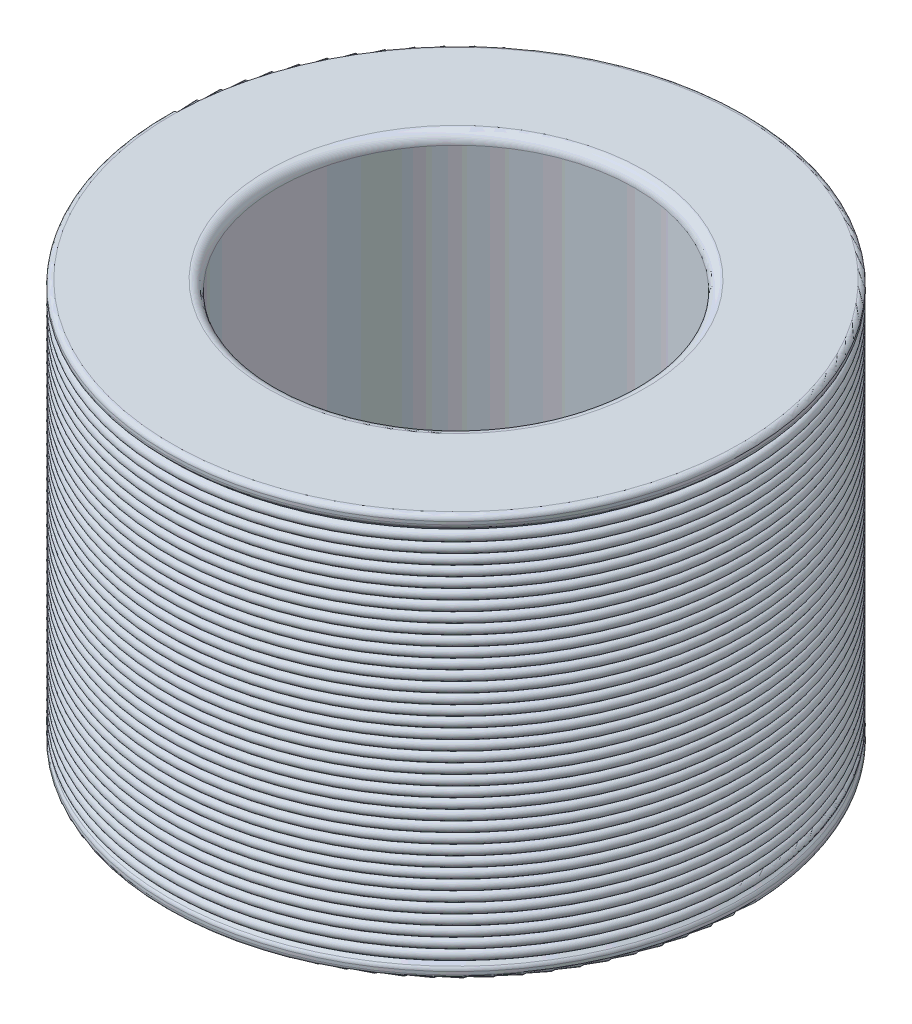
ISO-10303-21;
HEADER;
FILE_DESCRIPTION(('STEP AP214'),'2;1');
FILE_NAME('part.step','',(''),(''),'','','');
FILE_SCHEMA(('AUTOMOTIVE_DESIGN { 1 0 10303 214 1 1 1 1 }'));
ENDSEC;
DATA;
#1=APPLICATION_CONTEXT('core data for automotive mechanical design processes');
#2=APPLICATION_PROTOCOL_DEFINITION('international standard','automotive_design',2000,#1);
#3=PRODUCT_CONTEXT('',#1,'mechanical');
#4=PRODUCT('Part','Part','',(#3));
#5=PRODUCT_RELATED_PRODUCT_CATEGORY('part','',(#4));
#6=PRODUCT_DEFINITION_FORMATION('','',#4);
#7=PRODUCT_DEFINITION_CONTEXT('part definition',#1,'design');
#8=PRODUCT_DEFINITION('design','',#6,#7);
#9=PRODUCT_DEFINITION_SHAPE('','',#8);
#10=(LENGTH_UNIT() NAMED_UNIT(*) SI_UNIT(.MILLI.,.METRE.));
#11=(NAMED_UNIT(*) PLANE_ANGLE_UNIT() SI_UNIT($,.RADIAN.));
#12=(NAMED_UNIT(*) SI_UNIT($,.STERADIAN.) SOLID_ANGLE_UNIT());
#13=UNCERTAINTY_MEASURE_WITH_UNIT(LENGTH_MEASURE(1.E-05),#10,'distance_accuracy_value','');
#14=(GEOMETRIC_REPRESENTATION_CONTEXT(3) GLOBAL_UNCERTAINTY_ASSIGNED_CONTEXT((#13)) GLOBAL_UNIT_ASSIGNED_CONTEXT((#10,
#11,#12)) REPRESENTATION_CONTEXT('',''));
#15=CARTESIAN_POINT('',(0.,0.,0.));
#16=DIRECTION('',(0.,0.,1.));
#17=DIRECTION('',(1.,0.,0.));
#18=AXIS2_PLACEMENT_3D('',#15,#16,#17);
#19=CARTESIAN_POINT('',(0.,11.1343365087752,0.));
#20=DIRECTION('',(0.,1.,0.));
#21=DIRECTION('',(0.,0.,1.));
#22=AXIS2_PLACEMENT_3D('',#19,#20,#21);
#23=CYLINDRICAL_SURFACE('',#22,3.55);
#24=CARTESIAN_POINT('',(0.,0.199999999999999,0.));
#25=DIRECTION('',(0.,1.,0.));
#26=DIRECTION('',(0.,0.,1.));
#27=AXIS2_PLACEMENT_3D('',#24,#25,#26);
#28=CIRCLE('',#27,3.55);
#29=CARTESIAN_POINT('',(0.,0.199999999999999,3.55));
#30=VERTEX_POINT('',#29);
#31=EDGE_CURVE('E67',#30,#30,#28,.F.);
#32=ORIENTED_EDGE('',*,*,#31,.T.);
#33=EDGE_LOOP('',(#32));
#34=FACE_BOUND('',#33,.T.);
#35=CARTESIAN_POINT('',(0.,7.8,0.));
#36=DIRECTION('',(0.,-1.,0.));
#37=DIRECTION('',(0.,0.,-1.));
#38=AXIS2_PLACEMENT_3D('',#35,#36,#37);
#39=CIRCLE('',#38,3.55);
#40=CARTESIAN_POINT('',(0.,7.8,-3.55));
#41=VERTEX_POINT('',#40);
#42=EDGE_CURVE('E70',#41,#41,#39,.F.);
#43=ORIENTED_EDGE('',*,*,#42,.T.);
#44=EDGE_LOOP('',(#43));
#45=FACE_BOUND('',#44,.T.);
#46=ADVANCED_FACE('F32',(#34,#45),#23,.F.);
#47=CARTESIAN_POINT('',(0.,8.,-3.55));
#48=DIRECTION('',(0.,-1.,0.));
#49=DIRECTION('',(0.,0.,-1.));
#50=AXIS2_PLACEMENT_3D('',#47,#48,#49);
#51=PLANE('',#50);
#52=CARTESIAN_POINT('',(0.,8.,0.));
#53=DIRECTION('',(0.,-1.,0.));
#54=DIRECTION('',(0.,0.,-1.));
#55=AXIS2_PLACEMENT_3D('',#52,#53,#54);
#56=CIRCLE('',#55,5.65);
#57=CARTESIAN_POINT('',(0.,8.,-5.65));
#58=VERTEX_POINT('',#57);
#59=EDGE_CURVE('E39',#58,#58,#56,.F.);
#60=ORIENTED_EDGE('',*,*,#59,.T.);
#61=EDGE_LOOP('',(#60));
#62=FACE_BOUND('',#61,.T.);
#63=CARTESIAN_POINT('',(0.,8.,0.));
#64=DIRECTION('',(0.,-1.,0.));
#65=DIRECTION('',(0.,0.,-1.));
#66=AXIS2_PLACEMENT_3D('',#63,#64,#65);
#67=CIRCLE('',#66,3.75);
#68=CARTESIAN_POINT('',(0.,8.,-3.75));
#69=VERTEX_POINT('',#68);
#70=EDGE_CURVE('E64',#69,#69,#67,.T.);
#71=ORIENTED_EDGE('',*,*,#70,.T.);
#72=EDGE_LOOP('',(#71));
#73=FACE_BOUND('',#72,.T.);
#74=ADVANCED_FACE('F208',(#62,#73),#51,.F.);
#75=CARTESIAN_POINT('',(0.,11.1343365087752,0.));
#76=DIRECTION('',(0.,1.,0.));
#77=DIRECTION('',(0.,0.,1.));
#78=AXIS2_PLACEMENT_3D('',#75,#76,#77);
#79=CYLINDRICAL_SURFACE('',#78,5.75);
#80=CARTESIAN_POINT('',(0.,7.84142135623731,0.));
#81=DIRECTION('',(0.,-1.,0.));
#82=DIRECTION('',(0.,0.,-1.));
#83=AXIS2_PLACEMENT_3D('',#80,#81,#82);
#84=CIRCLE('',#83,5.75);
#85=CARTESIAN_POINT('',(0.,7.84142135623731,-5.75));
#86=VERTEX_POINT('',#85);
#87=EDGE_CURVE('E47',#86,#86,#84,.F.);
#88=ORIENTED_EDGE('',*,*,#87,.T.);
#89=EDGE_LOOP('',(#88));
#90=FACE_BOUND('',#89,.T.);
#91=CARTESIAN_POINT('',(0.,7.9,0.));
#92=DIRECTION('',(0.,-1.,0.));
#93=DIRECTION('',(0.,0.,-1.));
#94=AXIS2_PLACEMENT_3D('',#91,#92,#93);
#95=CIRCLE('',#94,5.75);
#96=CARTESIAN_POINT('',(0.,7.9,-5.75));
#97=VERTEX_POINT('',#96);
#98=EDGE_CURVE('E52',#97,#97,#95,.T.);
#99=ORIENTED_EDGE('',*,*,#98,.T.);
#100=EDGE_LOOP('',(#99));
#101=FACE_BOUND('',#100,.T.);
#102=ADVANCED_FACE('F214',(#90,#101),#79,.T.);
#103=CARTESIAN_POINT('',(0.,7.7,0.));
#104=DIRECTION('',(0.,1.,0.));
#105=DIRECTION('',(0.,0.,1.));
#106=AXIS2_PLACEMENT_3D('',#103,#104,#105);
#107=CONICAL_SURFACE('',#106,5.65,0.785398163397444);
#108=CARTESIAN_POINT('',(0.,7.77071067811865,0.));
#109=DIRECTION('',(0.,-1.,0.));
#110=DIRECTION('',(0.,0.,-1.));
#111=AXIS2_PLACEMENT_3D('',#108,#109,#110);
#112=CIRCLE('',#111,5.72071067811865);
#113=CARTESIAN_POINT('',(0.,7.77071067811865,-5.72071067811865));
#114=VERTEX_POINT('',#113);
#115=EDGE_CURVE('E43',#114,#114,#112,.T.);
#116=ORIENTED_EDGE('',*,*,#115,.T.);
#117=EDGE_LOOP('',(#116));
#118=FACE_BOUND('',#117,.T.);
#119=CARTESIAN_POINT('',(0.,7.7,0.));
#120=DIRECTION('',(0.,-1.,0.));
#121=DIRECTION('',(0.,0.,-1.));
#122=AXIS2_PLACEMENT_3D('',#119,#120,#121);
#123=CIRCLE('',#122,5.65);
#124=CARTESIAN_POINT('',(0.,7.7,-5.65));
#125=VERTEX_POINT('',#124);
#126=EDGE_CURVE('E79',#125,#125,#123,.T.);
#127=ORIENTED_EDGE('',*,*,#126,.F.);
#128=EDGE_LOOP('',(#127));
#129=FACE_BOUND('',#128,.T.);
#130=ADVANCED_FACE('F247',(#118,#129),#107,.T.);
#131=CARTESIAN_POINT('',(0.,0.199999999999999,0.));
#132=DIRECTION('',(0.,-1.,0.));
#133=DIRECTION('',(0.,0.,-1.));
#134=AXIS2_PLACEMENT_3D('',#131,#132,#133);
#135=CONICAL_SURFACE('',#134,5.75,0.785398163397435);
#136=CARTESIAN_POINT('',(0.,0.229289321881342,0.));
#137=DIRECTION('',(0.,1.,0.));
#138=DIRECTION('',(0.,0.,1.));
#139=AXIS2_PLACEMENT_3D('',#136,#137,#138);
#140=CIRCLE('',#139,5.72071067811866);
#141=CARTESIAN_POINT('',(0.,0.229289321881342,5.72071067811866));
#142=VERTEX_POINT('',#141);
#143=EDGE_CURVE('E61',#142,#142,#140,.T.);
#144=ORIENTED_EDGE('',*,*,#143,.T.);
#145=EDGE_LOOP('',(#144));
#146=FACE_BOUND('',#145,.T.);
#147=CARTESIAN_POINT('',(0.,0.3,0.));
#148=DIRECTION('',(0.,1.,0.));
#149=DIRECTION('',(0.,0.,1.));
#150=AXIS2_PLACEMENT_3D('',#147,#148,#149);
#151=CIRCLE('',#150,5.65);
#152=CARTESIAN_POINT('',(0.,0.3,5.65));
#153=VERTEX_POINT('',#152);
#154=EDGE_CURVE('E76',#153,#153,#151,.T.);
#155=ORIENTED_EDGE('',*,*,#154,.F.);
#156=EDGE_LOOP('',(#155));
#157=FACE_BOUND('',#156,.T.);
#158=ADVANCED_FACE('F252',(#146,#157),#135,.T.);
#159=CARTESIAN_POINT('',(0.,11.1343365087752,0.));
#160=DIRECTION('',(0.,1.,0.));
#161=DIRECTION('',(0.,0.,1.));
#162=AXIS2_PLACEMENT_3D('',#159,#160,#161);
#163=CYLINDRICAL_SURFACE('',#162,5.75);
#164=CARTESIAN_POINT('',(0.,0.158578643762688,0.));
#165=DIRECTION('',(0.,-1.,0.));
#166=DIRECTION('',(0.,0.,-1.));
#167=AXIS2_PLACEMENT_3D('',#164,#165,#166);
#168=CIRCLE('',#167,5.75);
#169=CARTESIAN_POINT('',(0.,0.158578643762688,-5.75));
#170=VERTEX_POINT('',#169);
#171=EDGE_CURVE('E55',#170,#170,#168,.T.);
#172=ORIENTED_EDGE('',*,*,#171,.T.);
#173=EDGE_LOOP('',(#172));
#174=FACE_BOUND('',#173,.T.);
#175=CARTESIAN_POINT('',(0.,0.0999999999999994,0.));
#176=DIRECTION('',(0.,1.,0.));
#177=DIRECTION('',(0.,0.,1.));
#178=AXIS2_PLACEMENT_3D('',#175,#176,#177);
#179=CIRCLE('',#178,5.75);
#180=CARTESIAN_POINT('',(0.,0.0999999999999994,5.75));
#181=VERTEX_POINT('',#180);
#182=EDGE_CURVE('E58',#181,#181,#179,.T.);
#183=ORIENTED_EDGE('',*,*,#182,.T.);
#184=EDGE_LOOP('',(#183));
#185=FACE_BOUND('',#184,.T.);
#186=ADVANCED_FACE('F258',(#174,#185),#163,.T.);
#187=CARTESIAN_POINT('',(0.,0.,-5.75));
#188=DIRECTION('',(0.,1.,0.));
#189=DIRECTION('',(0.,0.,1.));
#190=AXIS2_PLACEMENT_3D('',#187,#188,#189);
#191=PLANE('',#190);
#192=CARTESIAN_POINT('',(0.,0.,0.));
#193=DIRECTION('',(0.,1.,0.));
#194=DIRECTION('',(0.,0.,1.));
#195=AXIS2_PLACEMENT_3D('',#192,#193,#194);
#196=CIRCLE('',#195,5.65);
#197=CARTESIAN_POINT('',(0.,0.,5.65));
#198=VERTEX_POINT('',#197);
#199=EDGE_CURVE('E10',#198,#198,#196,.F.);
#200=ORIENTED_EDGE('',*,*,#199,.T.);
#201=EDGE_LOOP('',(#200));
#202=FACE_BOUND('',#201,.T.);
#203=CARTESIAN_POINT('',(0.,0.,0.));
#204=DIRECTION('',(0.,1.,0.));
#205=DIRECTION('',(0.,0.,1.));
#206=AXIS2_PLACEMENT_3D('',#203,#204,#205);
#207=CIRCLE('',#206,3.75);
#208=CARTESIAN_POINT('',(0.,0.,3.75));
#209=VERTEX_POINT('',#208);
#210=EDGE_CURVE('E73',#209,#209,#207,.T.);
#211=ORIENTED_EDGE('',*,*,#210,.T.);
#212=EDGE_LOOP('',(#211));
#213=FACE_BOUND('',#212,.T.);
#214=ADVANCED_FACE('F223',(#202,#213),#191,.F.);
#215=CARTESIAN_POINT('',(0.,0.199999999999999,0.));
#216=DIRECTION('',(0.,1.,0.));
#217=DIRECTION('',(0.,0.,1.));
#218=AXIS2_PLACEMENT_3D('',#215,#216,#217);
#219=TOROIDAL_SURFACE('',#218,3.75,0.2);
#220=ORIENTED_EDGE('',*,*,#31,.F.);
#221=EDGE_LOOP('',(#220));
#222=FACE_BOUND('',#221,.T.);
#223=ORIENTED_EDGE('',*,*,#210,.F.);
#224=EDGE_LOOP('',(#223));
#225=FACE_BOUND('',#224,.T.);
#226=ADVANCED_FACE('F219',(#222,#225),#219,.T.);
#227=CARTESIAN_POINT('',(0.,7.8,0.));
#228=DIRECTION('',(0.,-1.,0.));
#229=DIRECTION('',(0.,0.,-1.));
#230=AXIS2_PLACEMENT_3D('',#227,#228,#229);
#231=TOROIDAL_SURFACE('',#230,3.75,0.2);
#232=ORIENTED_EDGE('',*,*,#70,.F.);
#233=EDGE_LOOP('',(#232));
#234=FACE_BOUND('',#233,.T.);
#235=ORIENTED_EDGE('',*,*,#42,.F.);
#236=EDGE_LOOP('',(#235));
#237=FACE_BOUND('',#236,.T.);
#238=ADVANCED_FACE('F222',(#234,#237),#231,.T.);
#239=CARTESIAN_POINT('',(0.,0.158578643762688,0.));
#240=DIRECTION('',(0.,-1.,0.));
#241=DIRECTION('',(0.,0.,-1.));
#242=AXIS2_PLACEMENT_3D('',#239,#240,#241);
#243=TOROIDAL_SURFACE('',#242,5.65,0.1);
#244=ORIENTED_EDGE('',*,*,#171,.F.);
#245=EDGE_LOOP('',(#244));
#246=FACE_BOUND('',#245,.T.);
#247=ORIENTED_EDGE('',*,*,#143,.F.);
#248=EDGE_LOOP('',(#247));
#249=FACE_BOUND('',#248,.T.);
#250=ADVANCED_FACE('F227',(#246,#249),#243,.T.);
#251=CARTESIAN_POINT('',(0.,7.84142135623731,0.));
#252=DIRECTION('',(0.,-1.,0.));
#253=DIRECTION('',(0.,0.,-1.));
#254=AXIS2_PLACEMENT_3D('',#251,#252,#253);
#255=TOROIDAL_SURFACE('',#254,5.65,0.1);
#256=ORIENTED_EDGE('',*,*,#115,.F.);
#257=EDGE_LOOP('',(#256));
#258=FACE_BOUND('',#257,.T.);
#259=ORIENTED_EDGE('',*,*,#87,.F.);
#260=EDGE_LOOP('',(#259));
#261=FACE_BOUND('',#260,.T.);
#262=ADVANCED_FACE('F231',(#258,#261),#255,.T.);
#263=CARTESIAN_POINT('',(0.,7.9,0.));
#264=DIRECTION('',(0.,-1.,0.));
#265=DIRECTION('',(0.,0.,-1.));
#266=AXIS2_PLACEMENT_3D('',#263,#264,#265);
#267=TOROIDAL_SURFACE('',#266,5.65,0.1);
#268=ORIENTED_EDGE('',*,*,#98,.F.);
#269=EDGE_LOOP('',(#268));
#270=FACE_BOUND('',#269,.T.);
#271=ORIENTED_EDGE('',*,*,#59,.F.);
#272=EDGE_LOOP('',(#271));
#273=FACE_BOUND('',#272,.T.);
#274=ADVANCED_FACE('F234',(#270,#273),#267,.T.);
#275=CARTESIAN_POINT('',(0.,0.0999999999999994,0.));
#276=DIRECTION('',(0.,1.,0.));
#277=DIRECTION('',(0.,0.,1.));
#278=AXIS2_PLACEMENT_3D('',#275,#276,#277);
#279=TOROIDAL_SURFACE('',#278,5.65,0.1);
#280=ORIENTED_EDGE('',*,*,#199,.F.);
#281=EDGE_LOOP('',(#280));
#282=FACE_BOUND('',#281,.T.);
#283=ORIENTED_EDGE('',*,*,#182,.F.);
#284=EDGE_LOOP('',(#283));
#285=FACE_BOUND('',#284,.T.);
#286=ADVANCED_FACE('F34',(#282,#285),#279,.T.);
#287=CARTESIAN_POINT('',(0.,7.6,0.));
#288=DIRECTION('',(0.,-1.,0.));
#289=DIRECTION('',(0.,0.,-1.));
#290=AXIS2_PLACEMENT_3D('',#287,#288,#289);
#291=TOROIDAL_SURFACE('',#290,5.65,0.0999999999999998);
#292=ORIENTED_EDGE('',*,*,#126,.T.);
#293=EDGE_LOOP('',(#292));
#294=FACE_BOUND('',#293,.T.);
#295=CARTESIAN_POINT('',(0.,7.5,0.));
#296=DIRECTION('',(0.,-1.,0.));
#297=DIRECTION('',(0.,0.,-1.));
#298=AXIS2_PLACEMENT_3D('',#295,#296,#297);
#299=CIRCLE('',#298,5.65);
#300=CARTESIAN_POINT('',(0.,7.5,-5.65));
#301=VERTEX_POINT('',#300);
#302=EDGE_CURVE('E82',#301,#301,#299,.T.);
#303=ORIENTED_EDGE('',*,*,#302,.F.);
#304=EDGE_LOOP('',(#303));
#305=FACE_BOUND('',#304,.T.);
#306=ADVANCED_FACE('F241',(#294,#305),#291,.T.);
#307=CARTESIAN_POINT('',(0.,7.4,0.));
#308=DIRECTION('',(0.,-1.,0.));
#309=DIRECTION('',(0.,0.,-1.));
#310=AXIS2_PLACEMENT_3D('',#307,#308,#309);
#311=TOROIDAL_SURFACE('',#310,5.65,0.0999999999999998);
#312=ORIENTED_EDGE('',*,*,#302,.T.);
#313=EDGE_LOOP('',(#312));
#314=FACE_BOUND('',#313,.T.);
#315=CARTESIAN_POINT('',(0.,7.3,0.));
#316=DIRECTION('',(0.,-1.,0.));
#317=DIRECTION('',(0.,0.,-1.));
#318=AXIS2_PLACEMENT_3D('',#315,#316,#317);
#319=CIRCLE('',#318,5.65);
#320=CARTESIAN_POINT('',(0.,7.3,-5.65));
#321=VERTEX_POINT('',#320);
#322=EDGE_CURVE('E85',#321,#321,#319,.T.);
#323=ORIENTED_EDGE('',*,*,#322,.F.);
#324=EDGE_LOOP('',(#323));
#325=FACE_BOUND('',#324,.T.);
#326=ADVANCED_FACE('F267',(#314,#325),#311,.T.);
#327=CARTESIAN_POINT('',(0.,7.2,0.));
#328=DIRECTION('',(0.,-1.,0.));
#329=DIRECTION('',(0.,0.,-1.));
#330=AXIS2_PLACEMENT_3D('',#327,#328,#329);
#331=TOROIDAL_SURFACE('',#330,5.65,0.0999999999999998);
#332=ORIENTED_EDGE('',*,*,#322,.T.);
#333=EDGE_LOOP('',(#332));
#334=FACE_BOUND('',#333,.T.);
#335=CARTESIAN_POINT('',(0.,7.1,0.));
#336=DIRECTION('',(0.,-1.,0.));
#337=DIRECTION('',(0.,0.,-1.));
#338=AXIS2_PLACEMENT_3D('',#335,#336,#337);
#339=CIRCLE('',#338,5.65);
#340=CARTESIAN_POINT('',(0.,7.1,-5.65));
#341=VERTEX_POINT('',#340);
#342=EDGE_CURVE('E88',#341,#341,#339,.T.);
#343=ORIENTED_EDGE('',*,*,#342,.F.);
#344=EDGE_LOOP('',(#343));
#345=FACE_BOUND('',#344,.T.);
#346=ADVANCED_FACE('F271',(#334,#345),#331,.T.);
#347=CARTESIAN_POINT('',(0.,7.,0.));
#348=DIRECTION('',(0.,-1.,0.));
#349=DIRECTION('',(0.,0.,-1.));
#350=AXIS2_PLACEMENT_3D('',#347,#348,#349);
#351=TOROIDAL_SURFACE('',#350,5.65,0.0999999999999998);
#352=ORIENTED_EDGE('',*,*,#342,.T.);
#353=EDGE_LOOP('',(#352));
#354=FACE_BOUND('',#353,.T.);
#355=CARTESIAN_POINT('',(0.,6.9,0.));
#356=DIRECTION('',(0.,-1.,0.));
#357=DIRECTION('',(0.,0.,-1.));
#358=AXIS2_PLACEMENT_3D('',#355,#356,#357);
#359=CIRCLE('',#358,5.65);
#360=CARTESIAN_POINT('',(0.,6.9,-5.65));
#361=VERTEX_POINT('',#360);
#362=EDGE_CURVE('E91',#361,#361,#359,.T.);
#363=ORIENTED_EDGE('',*,*,#362,.F.);
#364=EDGE_LOOP('',(#363));
#365=FACE_BOUND('',#364,.T.);
#366=ADVANCED_FACE('F275',(#354,#365),#351,.T.);
#367=CARTESIAN_POINT('',(0.,6.8,0.));
#368=DIRECTION('',(0.,-1.,0.));
#369=DIRECTION('',(0.,0.,-1.));
#370=AXIS2_PLACEMENT_3D('',#367,#368,#369);
#371=TOROIDAL_SURFACE('',#370,5.65,0.0999999999999998);
#372=ORIENTED_EDGE('',*,*,#362,.T.);
#373=EDGE_LOOP('',(#372));
#374=FACE_BOUND('',#373,.T.);
#375=CARTESIAN_POINT('',(0.,6.7,0.));
#376=DIRECTION('',(0.,-1.,0.));
#377=DIRECTION('',(0.,0.,-1.));
#378=AXIS2_PLACEMENT_3D('',#375,#376,#377);
#379=CIRCLE('',#378,5.65);
#380=CARTESIAN_POINT('',(0.,6.7,-5.65));
#381=VERTEX_POINT('',#380);
#382=EDGE_CURVE('E94',#381,#381,#379,.T.);
#383=ORIENTED_EDGE('',*,*,#382,.F.);
#384=EDGE_LOOP('',(#383));
#385=FACE_BOUND('',#384,.T.);
#386=ADVANCED_FACE('F279',(#374,#385),#371,.T.);
#387=CARTESIAN_POINT('',(0.,6.6,0.));
#388=DIRECTION('',(0.,-1.,0.));
#389=DIRECTION('',(0.,0.,-1.));
#390=AXIS2_PLACEMENT_3D('',#387,#388,#389);
#391=TOROIDAL_SURFACE('',#390,5.65,0.0999999999999998);
#392=ORIENTED_EDGE('',*,*,#382,.T.);
#393=EDGE_LOOP('',(#392));
#394=FACE_BOUND('',#393,.T.);
#395=CARTESIAN_POINT('',(0.,6.5,0.));
#396=DIRECTION('',(0.,-1.,0.));
#397=DIRECTION('',(0.,0.,-1.));
#398=AXIS2_PLACEMENT_3D('',#395,#396,#397);
#399=CIRCLE('',#398,5.65);
#400=CARTESIAN_POINT('',(0.,6.5,-5.65));
#401=VERTEX_POINT('',#400);
#402=EDGE_CURVE('E97',#401,#401,#399,.T.);
#403=ORIENTED_EDGE('',*,*,#402,.F.);
#404=EDGE_LOOP('',(#403));
#405=FACE_BOUND('',#404,.T.);
#406=ADVANCED_FACE('F283',(#394,#405),#391,.T.);
#407=CARTESIAN_POINT('',(0.,6.4,0.));
#408=DIRECTION('',(0.,-1.,0.));
#409=DIRECTION('',(0.,0.,-1.));
#410=AXIS2_PLACEMENT_3D('',#407,#408,#409);
#411=TOROIDAL_SURFACE('',#410,5.65,0.0999999999999998);
#412=ORIENTED_EDGE('',*,*,#402,.T.);
#413=EDGE_LOOP('',(#412));
#414=FACE_BOUND('',#413,.T.);
#415=CARTESIAN_POINT('',(0.,6.3,0.));
#416=DIRECTION('',(0.,-1.,0.));
#417=DIRECTION('',(0.,0.,-1.));
#418=AXIS2_PLACEMENT_3D('',#415,#416,#417);
#419=CIRCLE('',#418,5.65);
#420=CARTESIAN_POINT('',(0.,6.3,-5.65));
#421=VERTEX_POINT('',#420);
#422=EDGE_CURVE('E100',#421,#421,#419,.T.);
#423=ORIENTED_EDGE('',*,*,#422,.F.);
#424=EDGE_LOOP('',(#423));
#425=FACE_BOUND('',#424,.T.);
#426=ADVANCED_FACE('F287',(#414,#425),#411,.T.);
#427=CARTESIAN_POINT('',(0.,6.2,0.));
#428=DIRECTION('',(0.,-1.,0.));
#429=DIRECTION('',(0.,0.,-1.));
#430=AXIS2_PLACEMENT_3D('',#427,#428,#429);
#431=TOROIDAL_SURFACE('',#430,5.65,0.0999999999999998);
#432=ORIENTED_EDGE('',*,*,#422,.T.);
#433=EDGE_LOOP('',(#432));
#434=FACE_BOUND('',#433,.T.);
#435=CARTESIAN_POINT('',(0.,6.1,0.));
#436=DIRECTION('',(0.,-1.,0.));
#437=DIRECTION('',(0.,0.,-1.));
#438=AXIS2_PLACEMENT_3D('',#435,#436,#437);
#439=CIRCLE('',#438,5.65);
#440=CARTESIAN_POINT('',(0.,6.1,-5.65));
#441=VERTEX_POINT('',#440);
#442=EDGE_CURVE('E103',#441,#441,#439,.T.);
#443=ORIENTED_EDGE('',*,*,#442,.F.);
#444=EDGE_LOOP('',(#443));
#445=FACE_BOUND('',#444,.T.);
#446=ADVANCED_FACE('F291',(#434,#445),#431,.T.);
#447=CARTESIAN_POINT('',(0.,6.,0.));
#448=DIRECTION('',(0.,-1.,0.));
#449=DIRECTION('',(0.,0.,-1.));
#450=AXIS2_PLACEMENT_3D('',#447,#448,#449);
#451=TOROIDAL_SURFACE('',#450,5.65,0.0999999999999998);
#452=ORIENTED_EDGE('',*,*,#442,.T.);
#453=EDGE_LOOP('',(#452));
#454=FACE_BOUND('',#453,.T.);
#455=CARTESIAN_POINT('',(0.,5.9,0.));
#456=DIRECTION('',(0.,-1.,0.));
#457=DIRECTION('',(0.,0.,-1.));
#458=AXIS2_PLACEMENT_3D('',#455,#456,#457);
#459=CIRCLE('',#458,5.65);
#460=CARTESIAN_POINT('',(0.,5.9,-5.65));
#461=VERTEX_POINT('',#460);
#462=EDGE_CURVE('E106',#461,#461,#459,.T.);
#463=ORIENTED_EDGE('',*,*,#462,.F.);
#464=EDGE_LOOP('',(#463));
#465=FACE_BOUND('',#464,.T.);
#466=ADVANCED_FACE('F295',(#454,#465),#451,.T.);
#467=CARTESIAN_POINT('',(0.,5.8,0.));
#468=DIRECTION('',(0.,-1.,0.));
#469=DIRECTION('',(0.,0.,-1.));
#470=AXIS2_PLACEMENT_3D('',#467,#468,#469);
#471=TOROIDAL_SURFACE('',#470,5.65,0.0999999999999998);
#472=ORIENTED_EDGE('',*,*,#462,.T.);
#473=EDGE_LOOP('',(#472));
#474=FACE_BOUND('',#473,.T.);
#475=CARTESIAN_POINT('',(0.,5.7,0.));
#476=DIRECTION('',(0.,-1.,0.));
#477=DIRECTION('',(0.,0.,-1.));
#478=AXIS2_PLACEMENT_3D('',#475,#476,#477);
#479=CIRCLE('',#478,5.65);
#480=CARTESIAN_POINT('',(0.,5.7,-5.65));
#481=VERTEX_POINT('',#480);
#482=EDGE_CURVE('E109',#481,#481,#479,.T.);
#483=ORIENTED_EDGE('',*,*,#482,.F.);
#484=EDGE_LOOP('',(#483));
#485=FACE_BOUND('',#484,.T.);
#486=ADVANCED_FACE('F299',(#474,#485),#471,.T.);
#487=CARTESIAN_POINT('',(0.,5.6,0.));
#488=DIRECTION('',(0.,-1.,0.));
#489=DIRECTION('',(0.,0.,-1.));
#490=AXIS2_PLACEMENT_3D('',#487,#488,#489);
#491=TOROIDAL_SURFACE('',#490,5.65,0.0999999999999998);
#492=ORIENTED_EDGE('',*,*,#482,.T.);
#493=EDGE_LOOP('',(#492));
#494=FACE_BOUND('',#493,.T.);
#495=CARTESIAN_POINT('',(0.,5.5,0.));
#496=DIRECTION('',(0.,-1.,0.));
#497=DIRECTION('',(0.,0.,-1.));
#498=AXIS2_PLACEMENT_3D('',#495,#496,#497);
#499=CIRCLE('',#498,5.65);
#500=CARTESIAN_POINT('',(0.,5.5,-5.65));
#501=VERTEX_POINT('',#500);
#502=EDGE_CURVE('E112',#501,#501,#499,.T.);
#503=ORIENTED_EDGE('',*,*,#502,.F.);
#504=EDGE_LOOP('',(#503));
#505=FACE_BOUND('',#504,.T.);
#506=ADVANCED_FACE('F303',(#494,#505),#491,.T.);
#507=CARTESIAN_POINT('',(0.,5.4,0.));
#508=DIRECTION('',(0.,-1.,0.));
#509=DIRECTION('',(0.,0.,-1.));
#510=AXIS2_PLACEMENT_3D('',#507,#508,#509);
#511=TOROIDAL_SURFACE('',#510,5.65,0.0999999999999998);
#512=ORIENTED_EDGE('',*,*,#502,.T.);
#513=EDGE_LOOP('',(#512));
#514=FACE_BOUND('',#513,.T.);
#515=CARTESIAN_POINT('',(0.,5.3,0.));
#516=DIRECTION('',(0.,-1.,0.));
#517=DIRECTION('',(0.,0.,-1.));
#518=AXIS2_PLACEMENT_3D('',#515,#516,#517);
#519=CIRCLE('',#518,5.65);
#520=CARTESIAN_POINT('',(0.,5.3,-5.65));
#521=VERTEX_POINT('',#520);
#522=EDGE_CURVE('E115',#521,#521,#519,.T.);
#523=ORIENTED_EDGE('',*,*,#522,.F.);
#524=EDGE_LOOP('',(#523));
#525=FACE_BOUND('',#524,.T.);
#526=ADVANCED_FACE('F307',(#514,#525),#511,.T.);
#527=CARTESIAN_POINT('',(0.,5.2,0.));
#528=DIRECTION('',(0.,-1.,0.));
#529=DIRECTION('',(0.,0.,-1.));
#530=AXIS2_PLACEMENT_3D('',#527,#528,#529);
#531=TOROIDAL_SURFACE('',#530,5.65,0.0999999999999998);
#532=ORIENTED_EDGE('',*,*,#522,.T.);
#533=EDGE_LOOP('',(#532));
#534=FACE_BOUND('',#533,.T.);
#535=CARTESIAN_POINT('',(0.,5.1,0.));
#536=DIRECTION('',(0.,-1.,0.));
#537=DIRECTION('',(0.,0.,-1.));
#538=AXIS2_PLACEMENT_3D('',#535,#536,#537);
#539=CIRCLE('',#538,5.65);
#540=CARTESIAN_POINT('',(0.,5.1,-5.65));
#541=VERTEX_POINT('',#540);
#542=EDGE_CURVE('E118',#541,#541,#539,.T.);
#543=ORIENTED_EDGE('',*,*,#542,.F.);
#544=EDGE_LOOP('',(#543));
#545=FACE_BOUND('',#544,.T.);
#546=ADVANCED_FACE('F311',(#534,#545),#531,.T.);
#547=CARTESIAN_POINT('',(0.,5.,0.));
#548=DIRECTION('',(0.,-1.,0.));
#549=DIRECTION('',(0.,0.,-1.));
#550=AXIS2_PLACEMENT_3D('',#547,#548,#549);
#551=TOROIDAL_SURFACE('',#550,5.65,0.0999999999999998);
#552=ORIENTED_EDGE('',*,*,#542,.T.);
#553=EDGE_LOOP('',(#552));
#554=FACE_BOUND('',#553,.T.);
#555=CARTESIAN_POINT('',(0.,4.9,0.));
#556=DIRECTION('',(0.,-1.,0.));
#557=DIRECTION('',(0.,0.,-1.));
#558=AXIS2_PLACEMENT_3D('',#555,#556,#557);
#559=CIRCLE('',#558,5.65);
#560=CARTESIAN_POINT('',(0.,4.9,-5.65));
#561=VERTEX_POINT('',#560);
#562=EDGE_CURVE('E121',#561,#561,#559,.T.);
#563=ORIENTED_EDGE('',*,*,#562,.F.);
#564=EDGE_LOOP('',(#563));
#565=FACE_BOUND('',#564,.T.);
#566=ADVANCED_FACE('F315',(#554,#565),#551,.T.);
#567=CARTESIAN_POINT('',(0.,4.8,0.));
#568=DIRECTION('',(0.,-1.,0.));
#569=DIRECTION('',(0.,0.,-1.));
#570=AXIS2_PLACEMENT_3D('',#567,#568,#569);
#571=TOROIDAL_SURFACE('',#570,5.65,0.0999999999999998);
#572=ORIENTED_EDGE('',*,*,#562,.T.);
#573=EDGE_LOOP('',(#572));
#574=FACE_BOUND('',#573,.T.);
#575=CARTESIAN_POINT('',(0.,4.7,0.));
#576=DIRECTION('',(0.,-1.,0.));
#577=DIRECTION('',(0.,0.,-1.));
#578=AXIS2_PLACEMENT_3D('',#575,#576,#577);
#579=CIRCLE('',#578,5.65);
#580=CARTESIAN_POINT('',(0.,4.7,-5.65));
#581=VERTEX_POINT('',#580);
#582=EDGE_CURVE('E124',#581,#581,#579,.T.);
#583=ORIENTED_EDGE('',*,*,#582,.F.);
#584=EDGE_LOOP('',(#583));
#585=FACE_BOUND('',#584,.T.);
#586=ADVANCED_FACE('F319',(#574,#585),#571,.T.);
#587=CARTESIAN_POINT('',(0.,4.6,0.));
#588=DIRECTION('',(0.,-1.,0.));
#589=DIRECTION('',(0.,0.,-1.));
#590=AXIS2_PLACEMENT_3D('',#587,#588,#589);
#591=TOROIDAL_SURFACE('',#590,5.65,0.0999999999999998);
#592=ORIENTED_EDGE('',*,*,#582,.T.);
#593=EDGE_LOOP('',(#592));
#594=FACE_BOUND('',#593,.T.);
#595=CARTESIAN_POINT('',(0.,4.5,0.));
#596=DIRECTION('',(0.,-1.,0.));
#597=DIRECTION('',(0.,0.,-1.));
#598=AXIS2_PLACEMENT_3D('',#595,#596,#597);
#599=CIRCLE('',#598,5.65);
#600=CARTESIAN_POINT('',(0.,4.5,-5.65));
#601=VERTEX_POINT('',#600);
#602=EDGE_CURVE('E127',#601,#601,#599,.T.);
#603=ORIENTED_EDGE('',*,*,#602,.F.);
#604=EDGE_LOOP('',(#603));
#605=FACE_BOUND('',#604,.T.);
#606=ADVANCED_FACE('F323',(#594,#605),#591,.T.);
#607=CARTESIAN_POINT('',(0.,4.4,0.));
#608=DIRECTION('',(0.,-1.,0.));
#609=DIRECTION('',(0.,0.,-1.));
#610=AXIS2_PLACEMENT_3D('',#607,#608,#609);
#611=TOROIDAL_SURFACE('',#610,5.65,0.0999999999999998);
#612=ORIENTED_EDGE('',*,*,#602,.T.);
#613=EDGE_LOOP('',(#612));
#614=FACE_BOUND('',#613,.T.);
#615=CARTESIAN_POINT('',(0.,4.3,0.));
#616=DIRECTION('',(0.,-1.,0.));
#617=DIRECTION('',(0.,0.,-1.));
#618=AXIS2_PLACEMENT_3D('',#615,#616,#617);
#619=CIRCLE('',#618,5.65);
#620=CARTESIAN_POINT('',(0.,4.3,-5.65));
#621=VERTEX_POINT('',#620);
#622=EDGE_CURVE('E130',#621,#621,#619,.T.);
#623=ORIENTED_EDGE('',*,*,#622,.F.);
#624=EDGE_LOOP('',(#623));
#625=FACE_BOUND('',#624,.T.);
#626=ADVANCED_FACE('F327',(#614,#625),#611,.T.);
#627=CARTESIAN_POINT('',(0.,4.2,0.));
#628=DIRECTION('',(0.,-1.,0.));
#629=DIRECTION('',(0.,0.,-1.));
#630=AXIS2_PLACEMENT_3D('',#627,#628,#629);
#631=TOROIDAL_SURFACE('',#630,5.65,0.0999999999999998);
#632=ORIENTED_EDGE('',*,*,#622,.T.);
#633=EDGE_LOOP('',(#632));
#634=FACE_BOUND('',#633,.T.);
#635=CARTESIAN_POINT('',(0.,4.1,0.));
#636=DIRECTION('',(0.,-1.,0.));
#637=DIRECTION('',(0.,0.,-1.));
#638=AXIS2_PLACEMENT_3D('',#635,#636,#637);
#639=CIRCLE('',#638,5.65);
#640=CARTESIAN_POINT('',(0.,4.1,-5.65));
#641=VERTEX_POINT('',#640);
#642=EDGE_CURVE('E133',#641,#641,#639,.T.);
#643=ORIENTED_EDGE('',*,*,#642,.F.);
#644=EDGE_LOOP('',(#643));
#645=FACE_BOUND('',#644,.T.);
#646=ADVANCED_FACE('F331',(#634,#645),#631,.T.);
#647=CARTESIAN_POINT('',(0.,4.,0.));
#648=DIRECTION('',(0.,-1.,0.));
#649=DIRECTION('',(0.,0.,-1.));
#650=AXIS2_PLACEMENT_3D('',#647,#648,#649);
#651=TOROIDAL_SURFACE('',#650,5.65,0.0999999999999998);
#652=ORIENTED_EDGE('',*,*,#642,.T.);
#653=EDGE_LOOP('',(#652));
#654=FACE_BOUND('',#653,.T.);
#655=CARTESIAN_POINT('',(0.,3.9,0.));
#656=DIRECTION('',(0.,-1.,0.));
#657=DIRECTION('',(0.,0.,-1.));
#658=AXIS2_PLACEMENT_3D('',#655,#656,#657);
#659=CIRCLE('',#658,5.65);
#660=CARTESIAN_POINT('',(0.,3.9,-5.65));
#661=VERTEX_POINT('',#660);
#662=EDGE_CURVE('E136',#661,#661,#659,.T.);
#663=ORIENTED_EDGE('',*,*,#662,.F.);
#664=EDGE_LOOP('',(#663));
#665=FACE_BOUND('',#664,.T.);
#666=ADVANCED_FACE('F335',(#654,#665),#651,.T.);
#667=CARTESIAN_POINT('',(0.,3.8,0.));
#668=DIRECTION('',(0.,-1.,0.));
#669=DIRECTION('',(0.,0.,-1.));
#670=AXIS2_PLACEMENT_3D('',#667,#668,#669);
#671=TOROIDAL_SURFACE('',#670,5.65,0.0999999999999998);
#672=ORIENTED_EDGE('',*,*,#662,.T.);
#673=EDGE_LOOP('',(#672));
#674=FACE_BOUND('',#673,.T.);
#675=CARTESIAN_POINT('',(0.,3.7,0.));
#676=DIRECTION('',(0.,-1.,0.));
#677=DIRECTION('',(0.,0.,-1.));
#678=AXIS2_PLACEMENT_3D('',#675,#676,#677);
#679=CIRCLE('',#678,5.65);
#680=CARTESIAN_POINT('',(0.,3.7,-5.65));
#681=VERTEX_POINT('',#680);
#682=EDGE_CURVE('E139',#681,#681,#679,.T.);
#683=ORIENTED_EDGE('',*,*,#682,.F.);
#684=EDGE_LOOP('',(#683));
#685=FACE_BOUND('',#684,.T.);
#686=ADVANCED_FACE('F339',(#674,#685),#671,.T.);
#687=CARTESIAN_POINT('',(0.,3.6,0.));
#688=DIRECTION('',(0.,-1.,0.));
#689=DIRECTION('',(0.,0.,-1.));
#690=AXIS2_PLACEMENT_3D('',#687,#688,#689);
#691=TOROIDAL_SURFACE('',#690,5.65,0.0999999999999998);
#692=ORIENTED_EDGE('',*,*,#682,.T.);
#693=EDGE_LOOP('',(#692));
#694=FACE_BOUND('',#693,.T.);
#695=CARTESIAN_POINT('',(0.,3.5,0.));
#696=DIRECTION('',(0.,-1.,0.));
#697=DIRECTION('',(0.,0.,-1.));
#698=AXIS2_PLACEMENT_3D('',#695,#696,#697);
#699=CIRCLE('',#698,5.65);
#700=CARTESIAN_POINT('',(0.,3.5,-5.65));
#701=VERTEX_POINT('',#700);
#702=EDGE_CURVE('E142',#701,#701,#699,.T.);
#703=ORIENTED_EDGE('',*,*,#702,.F.);
#704=EDGE_LOOP('',(#703));
#705=FACE_BOUND('',#704,.T.);
#706=ADVANCED_FACE('F343',(#694,#705),#691,.T.);
#707=CARTESIAN_POINT('',(0.,3.4,0.));
#708=DIRECTION('',(0.,-1.,0.));
#709=DIRECTION('',(0.,0.,-1.));
#710=AXIS2_PLACEMENT_3D('',#707,#708,#709);
#711=TOROIDAL_SURFACE('',#710,5.65,0.0999999999999998);
#712=ORIENTED_EDGE('',*,*,#702,.T.);
#713=EDGE_LOOP('',(#712));
#714=FACE_BOUND('',#713,.T.);
#715=CARTESIAN_POINT('',(0.,3.3,0.));
#716=DIRECTION('',(0.,-1.,0.));
#717=DIRECTION('',(0.,0.,-1.));
#718=AXIS2_PLACEMENT_3D('',#715,#716,#717);
#719=CIRCLE('',#718,5.65);
#720=CARTESIAN_POINT('',(0.,3.3,-5.65));
#721=VERTEX_POINT('',#720);
#722=EDGE_CURVE('E145',#721,#721,#719,.T.);
#723=ORIENTED_EDGE('',*,*,#722,.F.);
#724=EDGE_LOOP('',(#723));
#725=FACE_BOUND('',#724,.T.);
#726=ADVANCED_FACE('F347',(#714,#725),#711,.T.);
#727=CARTESIAN_POINT('',(0.,3.2,0.));
#728=DIRECTION('',(0.,-1.,0.));
#729=DIRECTION('',(0.,0.,-1.));
#730=AXIS2_PLACEMENT_3D('',#727,#728,#729);
#731=TOROIDAL_SURFACE('',#730,5.65,0.0999999999999998);
#732=ORIENTED_EDGE('',*,*,#722,.T.);
#733=EDGE_LOOP('',(#732));
#734=FACE_BOUND('',#733,.T.);
#735=CARTESIAN_POINT('',(0.,3.1,0.));
#736=DIRECTION('',(0.,-1.,0.));
#737=DIRECTION('',(0.,0.,-1.));
#738=AXIS2_PLACEMENT_3D('',#735,#736,#737);
#739=CIRCLE('',#738,5.65);
#740=CARTESIAN_POINT('',(0.,3.1,-5.65));
#741=VERTEX_POINT('',#740);
#742=EDGE_CURVE('E148',#741,#741,#739,.T.);
#743=ORIENTED_EDGE('',*,*,#742,.F.);
#744=EDGE_LOOP('',(#743));
#745=FACE_BOUND('',#744,.T.);
#746=ADVANCED_FACE('F351',(#734,#745),#731,.T.);
#747=CARTESIAN_POINT('',(0.,3.,0.));
#748=DIRECTION('',(0.,-1.,0.));
#749=DIRECTION('',(0.,0.,-1.));
#750=AXIS2_PLACEMENT_3D('',#747,#748,#749);
#751=TOROIDAL_SURFACE('',#750,5.65,0.0999999999999998);
#752=ORIENTED_EDGE('',*,*,#742,.T.);
#753=EDGE_LOOP('',(#752));
#754=FACE_BOUND('',#753,.T.);
#755=CARTESIAN_POINT('',(0.,2.9,0.));
#756=DIRECTION('',(0.,-1.,0.));
#757=DIRECTION('',(0.,0.,-1.));
#758=AXIS2_PLACEMENT_3D('',#755,#756,#757);
#759=CIRCLE('',#758,5.65);
#760=CARTESIAN_POINT('',(0.,2.9,-5.65));
#761=VERTEX_POINT('',#760);
#762=EDGE_CURVE('E151',#761,#761,#759,.T.);
#763=ORIENTED_EDGE('',*,*,#762,.F.);
#764=EDGE_LOOP('',(#763));
#765=FACE_BOUND('',#764,.T.);
#766=ADVANCED_FACE('F355',(#754,#765),#751,.T.);
#767=CARTESIAN_POINT('',(0.,2.8,0.));
#768=DIRECTION('',(0.,-1.,0.));
#769=DIRECTION('',(0.,0.,-1.));
#770=AXIS2_PLACEMENT_3D('',#767,#768,#769);
#771=TOROIDAL_SURFACE('',#770,5.65,0.0999999999999998);
#772=ORIENTED_EDGE('',*,*,#762,.T.);
#773=EDGE_LOOP('',(#772));
#774=FACE_BOUND('',#773,.T.);
#775=CARTESIAN_POINT('',(0.,2.7,0.));
#776=DIRECTION('',(0.,-1.,0.));
#777=DIRECTION('',(0.,0.,-1.));
#778=AXIS2_PLACEMENT_3D('',#775,#776,#777);
#779=CIRCLE('',#778,5.65);
#780=CARTESIAN_POINT('',(0.,2.7,-5.65));
#781=VERTEX_POINT('',#780);
#782=EDGE_CURVE('E154',#781,#781,#779,.T.);
#783=ORIENTED_EDGE('',*,*,#782,.F.);
#784=EDGE_LOOP('',(#783));
#785=FACE_BOUND('',#784,.T.);
#786=ADVANCED_FACE('F359',(#774,#785),#771,.T.);
#787=CARTESIAN_POINT('',(0.,2.6,0.));
#788=DIRECTION('',(0.,-1.,0.));
#789=DIRECTION('',(0.,0.,-1.));
#790=AXIS2_PLACEMENT_3D('',#787,#788,#789);
#791=TOROIDAL_SURFACE('',#790,5.65,0.0999999999999998);
#792=ORIENTED_EDGE('',*,*,#782,.T.);
#793=EDGE_LOOP('',(#792));
#794=FACE_BOUND('',#793,.T.);
#795=CARTESIAN_POINT('',(0.,2.5,0.));
#796=DIRECTION('',(0.,-1.,0.));
#797=DIRECTION('',(0.,0.,-1.));
#798=AXIS2_PLACEMENT_3D('',#795,#796,#797);
#799=CIRCLE('',#798,5.65);
#800=CARTESIAN_POINT('',(0.,2.5,-5.65));
#801=VERTEX_POINT('',#800);
#802=EDGE_CURVE('E157',#801,#801,#799,.T.);
#803=ORIENTED_EDGE('',*,*,#802,.F.);
#804=EDGE_LOOP('',(#803));
#805=FACE_BOUND('',#804,.T.);
#806=ADVANCED_FACE('F363',(#794,#805),#791,.T.);
#807=CARTESIAN_POINT('',(0.,2.4,0.));
#808=DIRECTION('',(0.,-1.,0.));
#809=DIRECTION('',(0.,0.,-1.));
#810=AXIS2_PLACEMENT_3D('',#807,#808,#809);
#811=TOROIDAL_SURFACE('',#810,5.65,0.0999999999999998);
#812=ORIENTED_EDGE('',*,*,#802,.T.);
#813=EDGE_LOOP('',(#812));
#814=FACE_BOUND('',#813,.T.);
#815=CARTESIAN_POINT('',(0.,2.3,0.));
#816=DIRECTION('',(0.,-1.,0.));
#817=DIRECTION('',(0.,0.,-1.));
#818=AXIS2_PLACEMENT_3D('',#815,#816,#817);
#819=CIRCLE('',#818,5.65);
#820=CARTESIAN_POINT('',(0.,2.3,-5.65));
#821=VERTEX_POINT('',#820);
#822=EDGE_CURVE('E160',#821,#821,#819,.T.);
#823=ORIENTED_EDGE('',*,*,#822,.F.);
#824=EDGE_LOOP('',(#823));
#825=FACE_BOUND('',#824,.T.);
#826=ADVANCED_FACE('F367',(#814,#825),#811,.T.);
#827=CARTESIAN_POINT('',(0.,2.2,0.));
#828=DIRECTION('',(0.,-1.,0.));
#829=DIRECTION('',(0.,0.,-1.));
#830=AXIS2_PLACEMENT_3D('',#827,#828,#829);
#831=TOROIDAL_SURFACE('',#830,5.65,0.0999999999999998);
#832=ORIENTED_EDGE('',*,*,#822,.T.);
#833=EDGE_LOOP('',(#832));
#834=FACE_BOUND('',#833,.T.);
#835=CARTESIAN_POINT('',(0.,2.1,0.));
#836=DIRECTION('',(0.,-1.,0.));
#837=DIRECTION('',(0.,0.,-1.));
#838=AXIS2_PLACEMENT_3D('',#835,#836,#837);
#839=CIRCLE('',#838,5.65);
#840=CARTESIAN_POINT('',(0.,2.1,-5.65));
#841=VERTEX_POINT('',#840);
#842=EDGE_CURVE('E163',#841,#841,#839,.T.);
#843=ORIENTED_EDGE('',*,*,#842,.F.);
#844=EDGE_LOOP('',(#843));
#845=FACE_BOUND('',#844,.T.);
#846=ADVANCED_FACE('F371',(#834,#845),#831,.T.);
#847=CARTESIAN_POINT('',(0.,2.,0.));
#848=DIRECTION('',(0.,-1.,0.));
#849=DIRECTION('',(0.,0.,-1.));
#850=AXIS2_PLACEMENT_3D('',#847,#848,#849);
#851=TOROIDAL_SURFACE('',#850,5.65,0.0999999999999998);
#852=ORIENTED_EDGE('',*,*,#842,.T.);
#853=EDGE_LOOP('',(#852));
#854=FACE_BOUND('',#853,.T.);
#855=CARTESIAN_POINT('',(0.,1.9,0.));
#856=DIRECTION('',(0.,-1.,0.));
#857=DIRECTION('',(0.,0.,-1.));
#858=AXIS2_PLACEMENT_3D('',#855,#856,#857);
#859=CIRCLE('',#858,5.65);
#860=CARTESIAN_POINT('',(0.,1.9,-5.65));
#861=VERTEX_POINT('',#860);
#862=EDGE_CURVE('E166',#861,#861,#859,.T.);
#863=ORIENTED_EDGE('',*,*,#862,.F.);
#864=EDGE_LOOP('',(#863));
#865=FACE_BOUND('',#864,.T.);
#866=ADVANCED_FACE('F375',(#854,#865),#851,.T.);
#867=CARTESIAN_POINT('',(0.,1.8,0.));
#868=DIRECTION('',(0.,-1.,0.));
#869=DIRECTION('',(0.,0.,-1.));
#870=AXIS2_PLACEMENT_3D('',#867,#868,#869);
#871=TOROIDAL_SURFACE('',#870,5.65,0.0999999999999998);
#872=ORIENTED_EDGE('',*,*,#862,.T.);
#873=EDGE_LOOP('',(#872));
#874=FACE_BOUND('',#873,.T.);
#875=CARTESIAN_POINT('',(0.,1.7,0.));
#876=DIRECTION('',(0.,-1.,0.));
#877=DIRECTION('',(0.,0.,-1.));
#878=AXIS2_PLACEMENT_3D('',#875,#876,#877);
#879=CIRCLE('',#878,5.65);
#880=CARTESIAN_POINT('',(0.,1.7,-5.65));
#881=VERTEX_POINT('',#880);
#882=EDGE_CURVE('E169',#881,#881,#879,.T.);
#883=ORIENTED_EDGE('',*,*,#882,.F.);
#884=EDGE_LOOP('',(#883));
#885=FACE_BOUND('',#884,.T.);
#886=ADVANCED_FACE('F379',(#874,#885),#871,.T.);
#887=CARTESIAN_POINT('',(0.,1.6,0.));
#888=DIRECTION('',(0.,-1.,0.));
#889=DIRECTION('',(0.,0.,-1.));
#890=AXIS2_PLACEMENT_3D('',#887,#888,#889);
#891=TOROIDAL_SURFACE('',#890,5.65,0.0999999999999998);
#892=ORIENTED_EDGE('',*,*,#882,.T.);
#893=EDGE_LOOP('',(#892));
#894=FACE_BOUND('',#893,.T.);
#895=CARTESIAN_POINT('',(0.,1.5,0.));
#896=DIRECTION('',(0.,-1.,0.));
#897=DIRECTION('',(0.,0.,-1.));
#898=AXIS2_PLACEMENT_3D('',#895,#896,#897);
#899=CIRCLE('',#898,5.65);
#900=CARTESIAN_POINT('',(0.,1.5,-5.65));
#901=VERTEX_POINT('',#900);
#902=EDGE_CURVE('E172',#901,#901,#899,.T.);
#903=ORIENTED_EDGE('',*,*,#902,.F.);
#904=EDGE_LOOP('',(#903));
#905=FACE_BOUND('',#904,.T.);
#906=ADVANCED_FACE('F383',(#894,#905),#891,.T.);
#907=CARTESIAN_POINT('',(0.,1.4,0.));
#908=DIRECTION('',(0.,-1.,0.));
#909=DIRECTION('',(0.,0.,-1.));
#910=AXIS2_PLACEMENT_3D('',#907,#908,#909);
#911=TOROIDAL_SURFACE('',#910,5.65,0.0999999999999998);
#912=ORIENTED_EDGE('',*,*,#902,.T.);
#913=EDGE_LOOP('',(#912));
#914=FACE_BOUND('',#913,.T.);
#915=CARTESIAN_POINT('',(0.,1.3,0.));
#916=DIRECTION('',(0.,-1.,0.));
#917=DIRECTION('',(0.,0.,-1.));
#918=AXIS2_PLACEMENT_3D('',#915,#916,#917);
#919=CIRCLE('',#918,5.65);
#920=CARTESIAN_POINT('',(0.,1.3,-5.65));
#921=VERTEX_POINT('',#920);
#922=EDGE_CURVE('E175',#921,#921,#919,.T.);
#923=ORIENTED_EDGE('',*,*,#922,.F.);
#924=EDGE_LOOP('',(#923));
#925=FACE_BOUND('',#924,.T.);
#926=ADVANCED_FACE('F387',(#914,#925),#911,.T.);
#927=CARTESIAN_POINT('',(0.,1.2,0.));
#928=DIRECTION('',(0.,-1.,0.));
#929=DIRECTION('',(0.,0.,-1.));
#930=AXIS2_PLACEMENT_3D('',#927,#928,#929);
#931=TOROIDAL_SURFACE('',#930,5.65,0.0999999999999998);
#932=ORIENTED_EDGE('',*,*,#922,.T.);
#933=EDGE_LOOP('',(#932));
#934=FACE_BOUND('',#933,.T.);
#935=CARTESIAN_POINT('',(0.,1.1,0.));
#936=DIRECTION('',(0.,-1.,0.));
#937=DIRECTION('',(0.,0.,-1.));
#938=AXIS2_PLACEMENT_3D('',#935,#936,#937);
#939=CIRCLE('',#938,5.65);
#940=CARTESIAN_POINT('',(0.,1.1,-5.65));
#941=VERTEX_POINT('',#940);
#942=EDGE_CURVE('E178',#941,#941,#939,.T.);
#943=ORIENTED_EDGE('',*,*,#942,.F.);
#944=EDGE_LOOP('',(#943));
#945=FACE_BOUND('',#944,.T.);
#946=ADVANCED_FACE('F391',(#934,#945),#931,.T.);
#947=CARTESIAN_POINT('',(0.,1.,0.));
#948=DIRECTION('',(0.,-1.,0.));
#949=DIRECTION('',(0.,0.,-1.));
#950=AXIS2_PLACEMENT_3D('',#947,#948,#949);
#951=TOROIDAL_SURFACE('',#950,5.65,0.0999999999999998);
#952=ORIENTED_EDGE('',*,*,#942,.T.);
#953=EDGE_LOOP('',(#952));
#954=FACE_BOUND('',#953,.T.);
#955=CARTESIAN_POINT('',(0.,0.9,0.));
#956=DIRECTION('',(0.,-1.,0.));
#957=DIRECTION('',(0.,0.,-1.));
#958=AXIS2_PLACEMENT_3D('',#955,#956,#957);
#959=CIRCLE('',#958,5.65);
#960=CARTESIAN_POINT('',(0.,0.9,-5.65));
#961=VERTEX_POINT('',#960);
#962=EDGE_CURVE('E181',#961,#961,#959,.T.);
#963=ORIENTED_EDGE('',*,*,#962,.F.);
#964=EDGE_LOOP('',(#963));
#965=FACE_BOUND('',#964,.T.);
#966=ADVANCED_FACE('F204',(#954,#965),#951,.T.);
#967=CARTESIAN_POINT('',(0.,0.799999999999999,0.));
#968=DIRECTION('',(0.,-1.,0.));
#969=DIRECTION('',(0.,0.,-1.));
#970=AXIS2_PLACEMENT_3D('',#967,#968,#969);
#971=TOROIDAL_SURFACE('',#970,5.65,0.0999999999999998);
#972=ORIENTED_EDGE('',*,*,#962,.T.);
#973=EDGE_LOOP('',(#972));
#974=FACE_BOUND('',#973,.T.);
#975=CARTESIAN_POINT('',(0.,0.699999999999999,0.));
#976=DIRECTION('',(0.,-1.,0.));
#977=DIRECTION('',(0.,0.,-1.));
#978=AXIS2_PLACEMENT_3D('',#975,#976,#977);
#979=CIRCLE('',#978,5.65);
#980=CARTESIAN_POINT('',(0.,0.699999999999999,-5.65));
#981=VERTEX_POINT('',#980);
#982=EDGE_CURVE('E184',#981,#981,#979,.T.);
#983=ORIENTED_EDGE('',*,*,#982,.F.);
#984=EDGE_LOOP('',(#983));
#985=FACE_BOUND('',#984,.T.);
#986=ADVANCED_FACE('F196',(#974,#985),#971,.T.);
#987=CARTESIAN_POINT('',(0.,0.6,0.));
#988=DIRECTION('',(0.,-1.,0.));
#989=DIRECTION('',(0.,0.,-1.));
#990=AXIS2_PLACEMENT_3D('',#987,#988,#989);
#991=TOROIDAL_SURFACE('',#990,5.65,0.0999999999999998);
#992=ORIENTED_EDGE('',*,*,#982,.T.);
#993=EDGE_LOOP('',(#992));
#994=FACE_BOUND('',#993,.T.);
#995=CARTESIAN_POINT('',(0.,0.5,0.));
#996=DIRECTION('',(0.,-1.,0.));
#997=DIRECTION('',(0.,0.,-1.));
#998=AXIS2_PLACEMENT_3D('',#995,#996,#997);
#999=CIRCLE('',#998,5.65);
#1000=CARTESIAN_POINT('',(0.,0.5,-5.65));
#1001=VERTEX_POINT('',#1000);
#1002=EDGE_CURVE('E187',#1001,#1001,#999,.T.);
#1003=ORIENTED_EDGE('',*,*,#1002,.F.);
#1004=EDGE_LOOP('',(#1003));
#1005=FACE_BOUND('',#1004,.T.);
#1006=ADVANCED_FACE('F194',(#994,#1005),#991,.T.);
#1007=CARTESIAN_POINT('',(0.,0.399999999999999,0.));
#1008=DIRECTION('',(0.,-1.,0.));
#1009=DIRECTION('',(0.,0.,-1.));
#1010=AXIS2_PLACEMENT_3D('',#1007,#1008,#1009);
#1011=TOROIDAL_SURFACE('',#1010,5.65,0.0999999999999998);
#1012=ORIENTED_EDGE('',*,*,#1002,.T.);
#1013=EDGE_LOOP('',(#1012));
#1014=FACE_BOUND('',#1013,.T.);
#1015=ORIENTED_EDGE('',*,*,#154,.T.);
#1016=EDGE_LOOP('',(#1015));
#1017=FACE_BOUND('',#1016,.T.);
#1018=ADVANCED_FACE('F191',(#1014,#1017),#1011,.T.);
#1019=CLOSED_SHELL('',(#46,#74,#102,#130,#158,#186,#214,#226,#238,#250,#262,#274,#286,#306,#326,
#346,#366,#386,#406,#426,#446,#466,#486,#506,#526,#546,#566,#586,#606,#626,#646,#666,#686,#706,
#726,#746,#766,#786,#806,#826,#846,#866,#886,#906,#926,#946,#966,#986,#1006,#1018));
#1020=MANIFOLD_SOLID_BREP('B2',#1019);
#1021=ADVANCED_BREP_SHAPE_REPRESENTATION('',(#18,#1020),#14);
#1022=SHAPE_DEFINITION_REPRESENTATION(#9,#1021);
ENDSEC;
END-ISO-10303-21;
